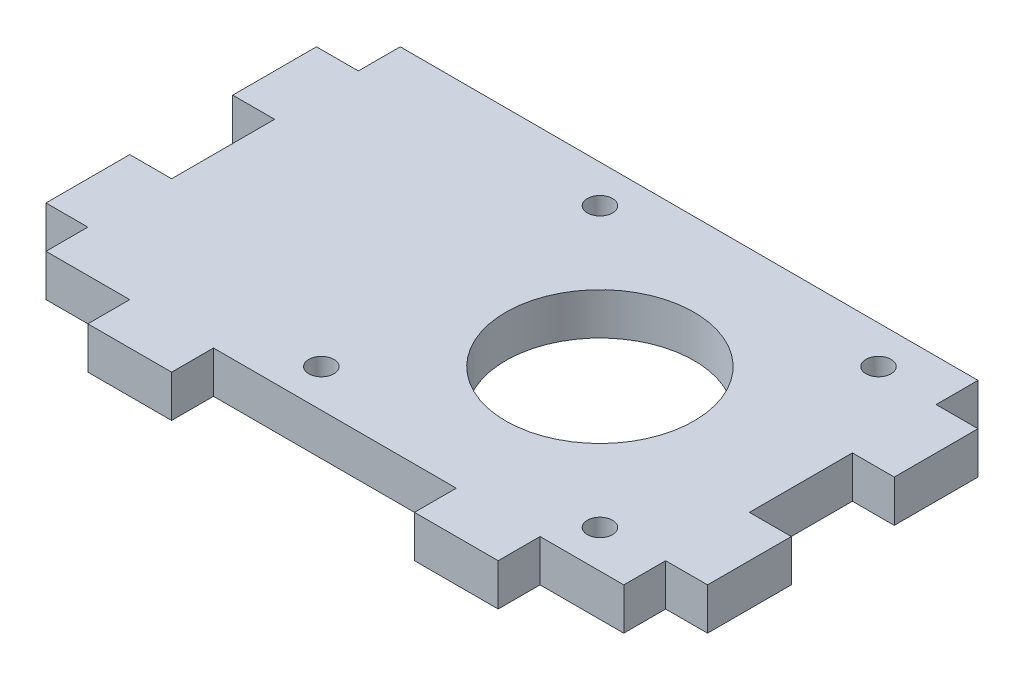
ISO-10303-21;
HEADER;
FILE_DESCRIPTION(('STEP AP214'),'2;1');
FILE_NAME('part.step','',(''),(''),'','','');
FILE_SCHEMA(('AUTOMOTIVE_DESIGN { 1 0 10303 214 1 1 1 1 }'));
ENDSEC;
DATA;
#1=APPLICATION_CONTEXT('core data for automotive mechanical design processes');
#2=APPLICATION_PROTOCOL_DEFINITION('international standard','automotive_design',2000,#1);
#3=PRODUCT_CONTEXT('',#1,'mechanical');
#4=PRODUCT('Part','Part','',(#3));
#5=PRODUCT_RELATED_PRODUCT_CATEGORY('part','',(#4));
#6=PRODUCT_DEFINITION_FORMATION('','',#4);
#7=PRODUCT_DEFINITION_CONTEXT('part definition',#1,'design');
#8=PRODUCT_DEFINITION('design','',#6,#7);
#9=PRODUCT_DEFINITION_SHAPE('','',#8);
#10=(LENGTH_UNIT() NAMED_UNIT(*) SI_UNIT(.MILLI.,.METRE.));
#11=(NAMED_UNIT(*) PLANE_ANGLE_UNIT() SI_UNIT($,.RADIAN.));
#12=(NAMED_UNIT(*) SI_UNIT($,.STERADIAN.) SOLID_ANGLE_UNIT());
#13=UNCERTAINTY_MEASURE_WITH_UNIT(LENGTH_MEASURE(1.E-05),#10,'distance_accuracy_value','');
#14=(GEOMETRIC_REPRESENTATION_CONTEXT(3) GLOBAL_UNCERTAINTY_ASSIGNED_CONTEXT((#13)) GLOBAL_UNIT_ASSIGNED_CONTEXT((#10,
#11,#12)) REPRESENTATION_CONTEXT('',''));
#15=CARTESIAN_POINT('',(0.,0.,0.));
#16=DIRECTION('',(0.,0.,1.));
#17=DIRECTION('',(1.,0.,0.));
#18=AXIS2_PLACEMENT_3D('',#15,#16,#17);
#19=CARTESIAN_POINT('',(0.,5.,0.));
#20=DIRECTION('',(0.,1.,0.));
#21=DIRECTION('',(0.,0.,1.));
#22=AXIS2_PLACEMENT_3D('',#19,#20,#21);
#23=PLANE('',#22);
#24=CARTESIAN_POINT('',(-6.13483146067414,5.,16.6348314606741));
#25=DIRECTION('',(0.,1.,0.));
#26=DIRECTION('',(0.,0.,1.));
#27=AXIS2_PLACEMENT_3D('',#24,#25,#26);
#28=CIRCLE('',#27,1.5);
#29=CARTESIAN_POINT('',(-6.13483146067414,5.,18.1348314606741));
#30=VERTEX_POINT('',#29);
#31=EDGE_CURVE('E504',#30,#30,#28,.T.);
#32=ORIENTED_EDGE('',*,*,#31,.F.);
#33=EDGE_LOOP('',(#32));
#34=FACE_BOUND('',#33,.T.);
#35=CARTESIAN_POINT('',(-6.13483146067414,5.,-16.6348314606741));
#36=DIRECTION('',(0.,1.,0.));
#37=DIRECTION('',(0.,0.,1.));
#38=AXIS2_PLACEMENT_3D('',#35,#36,#37);
#39=CIRCLE('',#38,1.5);
#40=CARTESIAN_POINT('',(-6.13483146067414,5.,-15.1348314606741));
#41=VERTEX_POINT('',#40);
#42=EDGE_CURVE('E516',#41,#41,#39,.T.);
#43=ORIENTED_EDGE('',*,*,#42,.F.);
#44=EDGE_LOOP('',(#43));
#45=FACE_BOUND('',#44,.T.);
#46=DIRECTION('',(0.,0.,-1.));
#47=VECTOR('',#46,1.);
#48=CARTESIAN_POINT('',(34.5,5.,16.15));
#49=LINE('',#48,#47);
#50=CARTESIAN_POINT('',(34.5,5.,21.15));
#51=VERTEX_POINT('',#50);
#52=CARTESIAN_POINT('',(34.5,5.,16.15));
#53=VERTEX_POINT('',#52);
#54=EDGE_CURVE('E306',#51,#53,#49,.T.);
#55=ORIENTED_EDGE('',*,*,#54,.T.);
#56=DIRECTION('',(1.,0.,0.));
#57=VECTOR('',#56,1.);
#58=CARTESIAN_POINT('',(34.5,5.,16.15));
#59=LINE('',#58,#57);
#60=CARTESIAN_POINT('',(39.5,5.,16.15));
#61=VERTEX_POINT('',#60);
#62=EDGE_CURVE('E154',#53,#61,#59,.T.);
#63=ORIENTED_EDGE('',*,*,#62,.T.);
#64=DIRECTION('',(0.,0.,-1.));
#65=VECTOR('',#64,1.);
#66=CARTESIAN_POINT('',(39.5,5.,16.15));
#67=LINE('',#66,#65);
#68=CARTESIAN_POINT('',(39.5,5.,6.15));
#69=VERTEX_POINT('',#68);
#70=EDGE_CURVE('E381',#61,#69,#67,.T.);
#71=ORIENTED_EDGE('',*,*,#70,.T.);
#72=DIRECTION('',(-1.,0.,0.));
#73=VECTOR('',#72,1.);
#74=CARTESIAN_POINT('',(34.5,5.,6.15));
#75=LINE('',#74,#73);
#76=CARTESIAN_POINT('',(34.5,5.,6.15));
#77=VERTEX_POINT('',#76);
#78=EDGE_CURVE('E400',#69,#77,#75,.T.);
#79=ORIENTED_EDGE('',*,*,#78,.T.);
#80=DIRECTION('',(0.,0.,-1.));
#81=VECTOR('',#80,1.);
#82=CARTESIAN_POINT('',(34.5,5.,-6.14999999999999));
#83=LINE('',#82,#81);
#84=CARTESIAN_POINT('',(34.5,5.,-6.14999999999999));
#85=VERTEX_POINT('',#84);
#86=EDGE_CURVE('E397',#77,#85,#83,.T.);
#87=ORIENTED_EDGE('',*,*,#86,.T.);
#88=DIRECTION('',(1.,0.,0.));
#89=VECTOR('',#88,1.);
#90=CARTESIAN_POINT('',(34.5,5.,-6.14999999999999));
#91=LINE('',#90,#89);
#92=CARTESIAN_POINT('',(39.5,5.,-6.14999999999999));
#93=VERTEX_POINT('',#92);
#94=EDGE_CURVE('E399',#85,#93,#91,.T.);
#95=ORIENTED_EDGE('',*,*,#94,.T.);
#96=DIRECTION('',(0.,0.,-1.));
#97=VECTOR('',#96,1.);
#98=CARTESIAN_POINT('',(39.5,5.,-16.15));
#99=LINE('',#98,#97);
#100=CARTESIAN_POINT('',(39.5,5.,-16.15));
#101=VERTEX_POINT('',#100);
#102=EDGE_CURVE('E402',#93,#101,#99,.T.);
#103=ORIENTED_EDGE('',*,*,#102,.T.);
#104=DIRECTION('',(-1.,0.,0.));
#105=VECTOR('',#104,1.);
#106=CARTESIAN_POINT('',(34.5,5.,-16.15));
#107=LINE('',#106,#105);
#108=CARTESIAN_POINT('',(34.5,5.,-16.15));
#109=VERTEX_POINT('',#108);
#110=EDGE_CURVE('E408',#101,#109,#107,.T.);
#111=ORIENTED_EDGE('',*,*,#110,.T.);
#112=DIRECTION('',(0.,0.,-1.));
#113=VECTOR('',#112,1.);
#114=CARTESIAN_POINT('',(34.5,5.,-21.15));
#115=LINE('',#114,#113);
#116=CARTESIAN_POINT('',(34.5,5.,-21.15));
#117=VERTEX_POINT('',#116);
#118=EDGE_CURVE('E410',#109,#117,#115,.T.);
#119=ORIENTED_EDGE('',*,*,#118,.T.);
#120=DIRECTION('',(-1.,0.,0.));
#121=VECTOR('',#120,1.);
#122=CARTESIAN_POINT('',(-34.5,5.,-21.15));
#123=LINE('',#122,#121);
#124=CARTESIAN_POINT('',(-34.5,5.,-21.15));
#125=VERTEX_POINT('',#124);
#126=EDGE_CURVE('E412',#117,#125,#123,.T.);
#127=ORIENTED_EDGE('',*,*,#126,.T.);
#128=DIRECTION('',(0.,0.,1.));
#129=VECTOR('',#128,1.);
#130=CARTESIAN_POINT('',(-34.5,5.,-21.15));
#131=LINE('',#130,#129);
#132=CARTESIAN_POINT('',(-34.5,5.,-16.15));
#133=VERTEX_POINT('',#132);
#134=EDGE_CURVE('E414',#125,#133,#131,.T.);
#135=ORIENTED_EDGE('',*,*,#134,.T.);
#136=DIRECTION('',(-1.,0.,0.));
#137=VECTOR('',#136,1.);
#138=CARTESIAN_POINT('',(-34.5,5.,-16.15));
#139=LINE('',#138,#137);
#140=CARTESIAN_POINT('',(-39.5,5.,-16.15));
#141=VERTEX_POINT('',#140);
#142=EDGE_CURVE('E416',#133,#141,#139,.T.);
#143=ORIENTED_EDGE('',*,*,#142,.T.);
#144=DIRECTION('',(0.,0.,1.));
#145=VECTOR('',#144,1.);
#146=CARTESIAN_POINT('',(-39.5,5.,-16.15));
#147=LINE('',#146,#145);
#148=CARTESIAN_POINT('',(-39.5,5.,-6.14999999999999));
#149=VERTEX_POINT('',#148);
#150=EDGE_CURVE('E418',#141,#149,#147,.T.);
#151=ORIENTED_EDGE('',*,*,#150,.T.);
#152=DIRECTION('',(1.,0.,0.));
#153=VECTOR('',#152,1.);
#154=CARTESIAN_POINT('',(-34.5,5.,-6.14999999999999));
#155=LINE('',#154,#153);
#156=CARTESIAN_POINT('',(-34.5,5.,-6.14999999999999));
#157=VERTEX_POINT('',#156);
#158=EDGE_CURVE('E420',#149,#157,#155,.T.);
#159=ORIENTED_EDGE('',*,*,#158,.T.);
#160=DIRECTION('',(0.,0.,1.));
#161=VECTOR('',#160,1.);
#162=CARTESIAN_POINT('',(-34.5,5.,-6.14999999999999));
#163=LINE('',#162,#161);
#164=CARTESIAN_POINT('',(-34.5,5.,6.15));
#165=VERTEX_POINT('',#164);
#166=EDGE_CURVE('E422',#157,#165,#163,.T.);
#167=ORIENTED_EDGE('',*,*,#166,.T.);
#168=DIRECTION('',(-1.,0.,0.));
#169=VECTOR('',#168,1.);
#170=CARTESIAN_POINT('',(-34.5,5.,6.15));
#171=LINE('',#170,#169);
#172=CARTESIAN_POINT('',(-39.5,5.,6.15));
#173=VERTEX_POINT('',#172);
#174=EDGE_CURVE('E424',#165,#173,#171,.T.);
#175=ORIENTED_EDGE('',*,*,#174,.T.);
#176=DIRECTION('',(0.,0.,1.));
#177=VECTOR('',#176,1.);
#178=CARTESIAN_POINT('',(-39.5,5.,16.15));
#179=LINE('',#178,#177);
#180=CARTESIAN_POINT('',(-39.5,5.,16.15));
#181=VERTEX_POINT('',#180);
#182=EDGE_CURVE('E426',#173,#181,#179,.T.);
#183=ORIENTED_EDGE('',*,*,#182,.T.);
#184=DIRECTION('',(1.,0.,0.));
#185=VECTOR('',#184,1.);
#186=CARTESIAN_POINT('',(-34.5,5.,16.15));
#187=LINE('',#186,#185);
#188=CARTESIAN_POINT('',(-34.5,5.,16.15));
#189=VERTEX_POINT('',#188);
#190=EDGE_CURVE('E428',#181,#189,#187,.T.);
#191=ORIENTED_EDGE('',*,*,#190,.T.);
#192=DIRECTION('',(0.,0.,1.));
#193=VECTOR('',#192,1.);
#194=CARTESIAN_POINT('',(-34.5,5.,16.15));
#195=LINE('',#194,#193);
#196=CARTESIAN_POINT('',(-34.5,5.,21.15));
#197=VERTEX_POINT('',#196);
#198=EDGE_CURVE('E430',#189,#197,#195,.T.);
#199=ORIENTED_EDGE('',*,*,#198,.T.);
#200=DIRECTION('',(1.,0.,0.));
#201=VECTOR('',#200,1.);
#202=CARTESIAN_POINT('',(-34.5,5.,21.15));
#203=LINE('',#202,#201);
#204=CARTESIAN_POINT('',(-24.5,5.,21.15));
#205=VERTEX_POINT('',#204);
#206=EDGE_CURVE('E432',#197,#205,#203,.T.);
#207=ORIENTED_EDGE('',*,*,#206,.T.);
#208=DIRECTION('',(0.,0.,1.));
#209=VECTOR('',#208,1.);
#210=CARTESIAN_POINT('',(-24.5,5.,21.15));
#211=LINE('',#210,#209);
#212=CARTESIAN_POINT('',(-24.5,5.,26.15));
#213=VERTEX_POINT('',#212);
#214=EDGE_CURVE('E434',#205,#213,#211,.T.);
#215=ORIENTED_EDGE('',*,*,#214,.T.);
#216=DIRECTION('',(1.,0.,0.));
#217=VECTOR('',#216,1.);
#218=CARTESIAN_POINT('',(-24.5,5.,26.15));
#219=LINE('',#218,#217);
#220=CARTESIAN_POINT('',(-14.5,5.,26.15));
#221=VERTEX_POINT('',#220);
#222=EDGE_CURVE('E436',#213,#221,#219,.T.);
#223=ORIENTED_EDGE('',*,*,#222,.T.);
#224=DIRECTION('',(0.,0.,-1.));
#225=VECTOR('',#224,1.);
#226=CARTESIAN_POINT('',(-14.5,5.,21.15));
#227=LINE('',#226,#225);
#228=CARTESIAN_POINT('',(-14.5,5.,21.15));
#229=VERTEX_POINT('',#228);
#230=EDGE_CURVE('E438',#221,#229,#227,.T.);
#231=ORIENTED_EDGE('',*,*,#230,.T.);
#232=DIRECTION('',(1.,0.,0.));
#233=VECTOR('',#232,1.);
#234=CARTESIAN_POINT('',(-14.5,5.,21.15));
#235=LINE('',#234,#233);
#236=CARTESIAN_POINT('',(14.5,5.,21.15));
#237=VERTEX_POINT('',#236);
#238=EDGE_CURVE('E440',#229,#237,#235,.T.);
#239=ORIENTED_EDGE('',*,*,#238,.T.);
#240=DIRECTION('',(0.,0.,1.));
#241=VECTOR('',#240,1.);
#242=CARTESIAN_POINT('',(14.5,5.,21.15));
#243=LINE('',#242,#241);
#244=CARTESIAN_POINT('',(14.5,5.,26.15));
#245=VERTEX_POINT('',#244);
#246=EDGE_CURVE('E233',#237,#245,#243,.T.);
#247=ORIENTED_EDGE('',*,*,#246,.T.);
#248=DIRECTION('',(1.,0.,0.));
#249=VECTOR('',#248,1.);
#250=CARTESIAN_POINT('',(24.5,5.,26.15));
#251=LINE('',#250,#249);
#252=CARTESIAN_POINT('',(24.5,5.,26.15));
#253=VERTEX_POINT('',#252);
#254=EDGE_CURVE('E227',#245,#253,#251,.T.);
#255=ORIENTED_EDGE('',*,*,#254,.T.);
#256=DIRECTION('',(0.,0.,-1.));
#257=VECTOR('',#256,1.);
#258=CARTESIAN_POINT('',(24.5,5.,21.15));
#259=LINE('',#258,#257);
#260=CARTESIAN_POINT('',(24.5,5.,21.15));
#261=VERTEX_POINT('',#260);
#262=EDGE_CURVE('E231',#253,#261,#259,.T.);
#263=ORIENTED_EDGE('',*,*,#262,.T.);
#264=DIRECTION('',(1.,0.,0.));
#265=VECTOR('',#264,1.);
#266=CARTESIAN_POINT('',(24.5,5.,21.15));
#267=LINE('',#266,#265);
#268=EDGE_CURVE('E51',#261,#51,#267,.T.);
#269=ORIENTED_EDGE('',*,*,#268,.T.);
#270=EDGE_LOOP('',(#55,#63,#71,#79,#87,#95,#103,#111,#119,#127,#135,#143,#151,#159,#167,#175,
#183,#191,#199,#207,#215,#223,#231,#239,#247,#255,#263,#269));
#271=FACE_BOUND('',#270,.T.);
#272=CARTESIAN_POINT('',(10.5,5.,0.));
#273=DIRECTION('',(0.,1.,0.));
#274=DIRECTION('',(0.,0.,1.));
#275=AXIS2_PLACEMENT_3D('',#272,#273,#274);
#276=CIRCLE('',#275,11.25);
#277=CARTESIAN_POINT('',(10.5,5.,11.25));
#278=VERTEX_POINT('',#277);
#279=EDGE_CURVE('E255',#278,#278,#276,.T.);
#280=ORIENTED_EDGE('',*,*,#279,.F.);
#281=EDGE_LOOP('',(#280));
#282=FACE_BOUND('',#281,.T.);
#283=CARTESIAN_POINT('',(27.1348314606741,5.,-16.6348314606741));
#284=DIRECTION('',(0.,1.,0.));
#285=DIRECTION('',(0.,0.,1.));
#286=AXIS2_PLACEMENT_3D('',#283,#284,#285);
#287=CIRCLE('',#286,1.5);
#288=CARTESIAN_POINT('',(27.1348314606741,5.,-15.1348314606741));
#289=VERTEX_POINT('',#288);
#290=EDGE_CURVE('E510',#289,#289,#287,.T.);
#291=ORIENTED_EDGE('',*,*,#290,.F.);
#292=EDGE_LOOP('',(#291));
#293=FACE_BOUND('',#292,.T.);
#294=CARTESIAN_POINT('',(27.1348314606741,5.,16.6348314606741));
#295=DIRECTION('',(0.,1.,0.));
#296=DIRECTION('',(0.,0.,1.));
#297=AXIS2_PLACEMENT_3D('',#294,#295,#296);
#298=CIRCLE('',#297,1.5);
#299=CARTESIAN_POINT('',(27.1348314606741,5.,18.1348314606741));
#300=VERTEX_POINT('',#299);
#301=EDGE_CURVE('E495',#300,#300,#298,.T.);
#302=ORIENTED_EDGE('',*,*,#301,.F.);
#303=EDGE_LOOP('',(#302));
#304=FACE_BOUND('',#303,.T.);
#305=ADVANCED_FACE('F34',(#34,#45,#271,#282,#293,#304),#23,.T.);
#306=CARTESIAN_POINT('',(0.,0.,0.));
#307=DIRECTION('',(0.,1.,0.));
#308=DIRECTION('',(0.,0.,1.));
#309=AXIS2_PLACEMENT_3D('',#306,#307,#308);
#310=PLANE('',#309);
#311=DIRECTION('',(0.,0.,-1.));
#312=VECTOR('',#311,1.);
#313=CARTESIAN_POINT('',(34.5,0.,16.15));
#314=LINE('',#313,#312);
#315=CARTESIAN_POINT('',(34.5,0.,21.15));
#316=VERTEX_POINT('',#315);
#317=CARTESIAN_POINT('',(34.5,0.,16.15));
#318=VERTEX_POINT('',#317);
#319=EDGE_CURVE('E251',#316,#318,#314,.T.);
#320=ORIENTED_EDGE('',*,*,#319,.F.);
#321=DIRECTION('',(1.,0.,0.));
#322=VECTOR('',#321,1.);
#323=CARTESIAN_POINT('',(24.5,0.,21.15));
#324=LINE('',#323,#322);
#325=CARTESIAN_POINT('',(24.5,0.,21.15));
#326=VERTEX_POINT('',#325);
#327=EDGE_CURVE('E146',#326,#316,#324,.T.);
#328=ORIENTED_EDGE('',*,*,#327,.F.);
#329=DIRECTION('',(0.,0.,-1.));
#330=VECTOR('',#329,1.);
#331=CARTESIAN_POINT('',(24.5,0.,21.15));
#332=LINE('',#331,#330);
#333=CARTESIAN_POINT('',(24.5,0.,26.15));
#334=VERTEX_POINT('',#333);
#335=EDGE_CURVE('E140',#334,#326,#332,.T.);
#336=ORIENTED_EDGE('',*,*,#335,.F.);
#337=DIRECTION('',(1.,0.,0.));
#338=VECTOR('',#337,1.);
#339=CARTESIAN_POINT('',(24.5,0.,26.15));
#340=LINE('',#339,#338);
#341=CARTESIAN_POINT('',(14.5,0.,26.15));
#342=VERTEX_POINT('',#341);
#343=EDGE_CURVE('E241',#342,#334,#340,.T.);
#344=ORIENTED_EDGE('',*,*,#343,.F.);
#345=DIRECTION('',(0.,0.,1.));
#346=VECTOR('',#345,1.);
#347=CARTESIAN_POINT('',(14.5,0.,21.15));
#348=LINE('',#347,#346);
#349=CARTESIAN_POINT('',(14.5,0.,21.15));
#350=VERTEX_POINT('',#349);
#351=EDGE_CURVE('E301',#350,#342,#348,.T.);
#352=ORIENTED_EDGE('',*,*,#351,.F.);
#353=DIRECTION('',(1.,0.,0.));
#354=VECTOR('',#353,1.);
#355=CARTESIAN_POINT('',(-14.5,0.,21.15));
#356=LINE('',#355,#354);
#357=CARTESIAN_POINT('',(-14.5,0.,21.15));
#358=VERTEX_POINT('',#357);
#359=EDGE_CURVE('E299',#358,#350,#356,.T.);
#360=ORIENTED_EDGE('',*,*,#359,.F.);
#361=DIRECTION('',(0.,0.,-1.));
#362=VECTOR('',#361,1.);
#363=CARTESIAN_POINT('',(-14.5,0.,21.15));
#364=LINE('',#363,#362);
#365=CARTESIAN_POINT('',(-14.5,0.,26.15));
#366=VERTEX_POINT('',#365);
#367=EDGE_CURVE('E297',#366,#358,#364,.T.);
#368=ORIENTED_EDGE('',*,*,#367,.F.);
#369=DIRECTION('',(1.,0.,0.));
#370=VECTOR('',#369,1.);
#371=CARTESIAN_POINT('',(-24.5,0.,26.15));
#372=LINE('',#371,#370);
#373=CARTESIAN_POINT('',(-24.5,0.,26.15));
#374=VERTEX_POINT('',#373);
#375=EDGE_CURVE('E295',#374,#366,#372,.T.);
#376=ORIENTED_EDGE('',*,*,#375,.F.);
#377=DIRECTION('',(0.,0.,1.));
#378=VECTOR('',#377,1.);
#379=CARTESIAN_POINT('',(-24.5,0.,21.15));
#380=LINE('',#379,#378);
#381=CARTESIAN_POINT('',(-24.5,0.,21.15));
#382=VERTEX_POINT('',#381);
#383=EDGE_CURVE('E293',#382,#374,#380,.T.);
#384=ORIENTED_EDGE('',*,*,#383,.F.);
#385=DIRECTION('',(1.,0.,0.));
#386=VECTOR('',#385,1.);
#387=CARTESIAN_POINT('',(-34.5,0.,21.15));
#388=LINE('',#387,#386);
#389=CARTESIAN_POINT('',(-34.5,0.,21.15));
#390=VERTEX_POINT('',#389);
#391=EDGE_CURVE('E291',#390,#382,#388,.T.);
#392=ORIENTED_EDGE('',*,*,#391,.F.);
#393=DIRECTION('',(0.,0.,1.));
#394=VECTOR('',#393,1.);
#395=CARTESIAN_POINT('',(-34.5,0.,16.15));
#396=LINE('',#395,#394);
#397=CARTESIAN_POINT('',(-34.5,0.,16.15));
#398=VERTEX_POINT('',#397);
#399=EDGE_CURVE('E289',#398,#390,#396,.T.);
#400=ORIENTED_EDGE('',*,*,#399,.F.);
#401=DIRECTION('',(1.,0.,0.));
#402=VECTOR('',#401,1.);
#403=CARTESIAN_POINT('',(-34.5,0.,16.15));
#404=LINE('',#403,#402);
#405=CARTESIAN_POINT('',(-39.5,0.,16.15));
#406=VERTEX_POINT('',#405);
#407=EDGE_CURVE('E287',#406,#398,#404,.T.);
#408=ORIENTED_EDGE('',*,*,#407,.F.);
#409=DIRECTION('',(0.,0.,1.));
#410=VECTOR('',#409,1.);
#411=CARTESIAN_POINT('',(-39.5,0.,16.15));
#412=LINE('',#411,#410);
#413=CARTESIAN_POINT('',(-39.5,0.,6.15));
#414=VERTEX_POINT('',#413);
#415=EDGE_CURVE('E285',#414,#406,#412,.T.);
#416=ORIENTED_EDGE('',*,*,#415,.F.);
#417=DIRECTION('',(-1.,0.,0.));
#418=VECTOR('',#417,1.);
#419=CARTESIAN_POINT('',(-34.5,0.,6.15));
#420=LINE('',#419,#418);
#421=CARTESIAN_POINT('',(-34.5,0.,6.15));
#422=VERTEX_POINT('',#421);
#423=EDGE_CURVE('E283',#422,#414,#420,.T.);
#424=ORIENTED_EDGE('',*,*,#423,.F.);
#425=DIRECTION('',(0.,0.,1.));
#426=VECTOR('',#425,1.);
#427=CARTESIAN_POINT('',(-34.5,0.,-6.14999999999999));
#428=LINE('',#427,#426);
#429=CARTESIAN_POINT('',(-34.5,0.,-6.14999999999999));
#430=VERTEX_POINT('',#429);
#431=EDGE_CURVE('E281',#430,#422,#428,.T.);
#432=ORIENTED_EDGE('',*,*,#431,.F.);
#433=DIRECTION('',(1.,0.,0.));
#434=VECTOR('',#433,1.);
#435=CARTESIAN_POINT('',(-34.5,0.,-6.14999999999999));
#436=LINE('',#435,#434);
#437=CARTESIAN_POINT('',(-39.5,0.,-6.14999999999999));
#438=VERTEX_POINT('',#437);
#439=EDGE_CURVE('E279',#438,#430,#436,.T.);
#440=ORIENTED_EDGE('',*,*,#439,.F.);
#441=DIRECTION('',(0.,0.,1.));
#442=VECTOR('',#441,1.);
#443=CARTESIAN_POINT('',(-39.5,0.,-16.15));
#444=LINE('',#443,#442);
#445=CARTESIAN_POINT('',(-39.5,0.,-16.15));
#446=VERTEX_POINT('',#445);
#447=EDGE_CURVE('E277',#446,#438,#444,.T.);
#448=ORIENTED_EDGE('',*,*,#447,.F.);
#449=DIRECTION('',(-1.,0.,0.));
#450=VECTOR('',#449,1.);
#451=CARTESIAN_POINT('',(-34.5,0.,-16.15));
#452=LINE('',#451,#450);
#453=CARTESIAN_POINT('',(-34.5,0.,-16.15));
#454=VERTEX_POINT('',#453);
#455=EDGE_CURVE('E275',#454,#446,#452,.T.);
#456=ORIENTED_EDGE('',*,*,#455,.F.);
#457=DIRECTION('',(0.,0.,1.));
#458=VECTOR('',#457,1.);
#459=CARTESIAN_POINT('',(-34.5,0.,-21.15));
#460=LINE('',#459,#458);
#461=CARTESIAN_POINT('',(-34.5,0.,-21.15));
#462=VERTEX_POINT('',#461);
#463=EDGE_CURVE('E273',#462,#454,#460,.T.);
#464=ORIENTED_EDGE('',*,*,#463,.F.);
#465=DIRECTION('',(-1.,0.,0.));
#466=VECTOR('',#465,1.);
#467=CARTESIAN_POINT('',(-34.5,0.,-21.15));
#468=LINE('',#467,#466);
#469=CARTESIAN_POINT('',(34.5,0.,-21.15));
#470=VERTEX_POINT('',#469);
#471=EDGE_CURVE('E271',#470,#462,#468,.T.);
#472=ORIENTED_EDGE('',*,*,#471,.F.);
#473=DIRECTION('',(0.,0.,-1.));
#474=VECTOR('',#473,1.);
#475=CARTESIAN_POINT('',(34.5,0.,-21.15));
#476=LINE('',#475,#474);
#477=CARTESIAN_POINT('',(34.5,0.,-16.15));
#478=VERTEX_POINT('',#477);
#479=EDGE_CURVE('E269',#478,#470,#476,.T.);
#480=ORIENTED_EDGE('',*,*,#479,.F.);
#481=DIRECTION('',(-1.,0.,0.));
#482=VECTOR('',#481,1.);
#483=CARTESIAN_POINT('',(34.5,0.,-16.15));
#484=LINE('',#483,#482);
#485=CARTESIAN_POINT('',(39.5,0.,-16.15));
#486=VERTEX_POINT('',#485);
#487=EDGE_CURVE('E267',#486,#478,#484,.T.);
#488=ORIENTED_EDGE('',*,*,#487,.F.);
#489=DIRECTION('',(0.,0.,-1.));
#490=VECTOR('',#489,1.);
#491=CARTESIAN_POINT('',(39.5,0.,-16.15));
#492=LINE('',#491,#490);
#493=CARTESIAN_POINT('',(39.5,0.,-6.14999999999999));
#494=VERTEX_POINT('',#493);
#495=EDGE_CURVE('E265',#494,#486,#492,.T.);
#496=ORIENTED_EDGE('',*,*,#495,.F.);
#497=DIRECTION('',(1.,0.,0.));
#498=VECTOR('',#497,1.);
#499=CARTESIAN_POINT('',(34.5,0.,-6.14999999999999));
#500=LINE('',#499,#498);
#501=CARTESIAN_POINT('',(34.5,0.,-6.14999999999999));
#502=VERTEX_POINT('',#501);
#503=EDGE_CURVE('E263',#502,#494,#500,.T.);
#504=ORIENTED_EDGE('',*,*,#503,.F.);
#505=DIRECTION('',(0.,0.,-1.));
#506=VECTOR('',#505,1.);
#507=CARTESIAN_POINT('',(34.5,0.,-6.14999999999999));
#508=LINE('',#507,#506);
#509=CARTESIAN_POINT('',(34.5,0.,6.15));
#510=VERTEX_POINT('',#509);
#511=EDGE_CURVE('E261',#510,#502,#508,.T.);
#512=ORIENTED_EDGE('',*,*,#511,.F.);
#513=DIRECTION('',(-1.,0.,0.));
#514=VECTOR('',#513,1.);
#515=CARTESIAN_POINT('',(34.5,0.,6.15));
#516=LINE('',#515,#514);
#517=CARTESIAN_POINT('',(39.5,0.,6.15));
#518=VERTEX_POINT('',#517);
#519=EDGE_CURVE('E259',#518,#510,#516,.T.);
#520=ORIENTED_EDGE('',*,*,#519,.F.);
#521=DIRECTION('',(0.,0.,-1.));
#522=VECTOR('',#521,1.);
#523=CARTESIAN_POINT('',(39.5,0.,16.15));
#524=LINE('',#523,#522);
#525=CARTESIAN_POINT('',(39.5,0.,16.15));
#526=VERTEX_POINT('',#525);
#527=EDGE_CURVE('E257',#526,#518,#524,.T.);
#528=ORIENTED_EDGE('',*,*,#527,.F.);
#529=DIRECTION('',(1.,0.,0.));
#530=VECTOR('',#529,1.);
#531=CARTESIAN_POINT('',(34.5,0.,16.15));
#532=LINE('',#531,#530);
#533=EDGE_CURVE('E254',#318,#526,#532,.T.);
#534=ORIENTED_EDGE('',*,*,#533,.F.);
#535=EDGE_LOOP('',(#320,#328,#336,#344,#352,#360,#368,#376,#384,#392,#400,#408,#416,#424,#432,
#440,#448,#456,#464,#472,#480,#488,#496,#504,#512,#520,#528,#534));
#536=FACE_BOUND('',#535,.T.);
#537=CARTESIAN_POINT('',(10.5,0.,0.));
#538=DIRECTION('',(0.,1.,0.));
#539=DIRECTION('',(0.,0.,1.));
#540=AXIS2_PLACEMENT_3D('',#537,#538,#539);
#541=CIRCLE('',#540,11.25);
#542=CARTESIAN_POINT('',(10.5,0.,11.25));
#543=VERTEX_POINT('',#542);
#544=EDGE_CURVE('E519',#543,#543,#541,.T.);
#545=ORIENTED_EDGE('',*,*,#544,.T.);
#546=EDGE_LOOP('',(#545));
#547=FACE_BOUND('',#546,.T.);
#548=CARTESIAN_POINT('',(-6.13483146067414,0.,-16.6348314606741));
#549=DIRECTION('',(0.,1.,0.));
#550=DIRECTION('',(0.,0.,1.));
#551=AXIS2_PLACEMENT_3D('',#548,#549,#550);
#552=CIRCLE('',#551,1.5);
#553=CARTESIAN_POINT('',(-6.13483146067414,0.,-15.1348314606741));
#554=VERTEX_POINT('',#553);
#555=EDGE_CURVE('E513',#554,#554,#552,.T.);
#556=ORIENTED_EDGE('',*,*,#555,.T.);
#557=EDGE_LOOP('',(#556));
#558=FACE_BOUND('',#557,.T.);
#559=CARTESIAN_POINT('',(27.1348314606741,0.,-16.6348314606741));
#560=DIRECTION('',(0.,1.,0.));
#561=DIRECTION('',(0.,0.,1.));
#562=AXIS2_PLACEMENT_3D('',#559,#560,#561);
#563=CIRCLE('',#562,1.5);
#564=CARTESIAN_POINT('',(27.1348314606741,0.,-15.1348314606741));
#565=VERTEX_POINT('',#564);
#566=EDGE_CURVE('E507',#565,#565,#563,.T.);
#567=ORIENTED_EDGE('',*,*,#566,.T.);
#568=EDGE_LOOP('',(#567));
#569=FACE_BOUND('',#568,.T.);
#570=CARTESIAN_POINT('',(-6.13483146067414,0.,16.6348314606741));
#571=DIRECTION('',(0.,1.,0.));
#572=DIRECTION('',(0.,0.,1.));
#573=AXIS2_PLACEMENT_3D('',#570,#571,#572);
#574=CIRCLE('',#573,1.5);
#575=CARTESIAN_POINT('',(-6.13483146067414,0.,18.1348314606741));
#576=VERTEX_POINT('',#575);
#577=EDGE_CURVE('E501',#576,#576,#574,.T.);
#578=ORIENTED_EDGE('',*,*,#577,.T.);
#579=EDGE_LOOP('',(#578));
#580=FACE_BOUND('',#579,.T.);
#581=CARTESIAN_POINT('',(27.1348314606741,0.,16.6348314606741));
#582=DIRECTION('',(0.,1.,0.));
#583=DIRECTION('',(0.,0.,1.));
#584=AXIS2_PLACEMENT_3D('',#581,#582,#583);
#585=CIRCLE('',#584,1.5);
#586=CARTESIAN_POINT('',(27.1348314606741,0.,18.1348314606741));
#587=VERTEX_POINT('',#586);
#588=EDGE_CURVE('E498',#587,#587,#585,.T.);
#589=ORIENTED_EDGE('',*,*,#588,.T.);
#590=EDGE_LOOP('',(#589));
#591=FACE_BOUND('',#590,.T.);
#592=ADVANCED_FACE('F385',(#536,#547,#558,#569,#580,#591),#310,.F.);
#593=CARTESIAN_POINT('',(34.5,5.,16.15));
#594=DIRECTION('',(-1.,0.,0.));
#595=DIRECTION('',(0.,0.,1.));
#596=AXIS2_PLACEMENT_3D('',#593,#594,#595);
#597=PLANE('',#596);
#598=ORIENTED_EDGE('',*,*,#319,.T.);
#599=DIRECTION('',(0.,-1.,0.));
#600=VECTOR('',#599,1.);
#601=CARTESIAN_POINT('',(34.5,5.,16.15));
#602=LINE('',#601,#600);
#603=EDGE_CURVE('E11',#53,#318,#602,.T.);
#604=ORIENTED_EDGE('',*,*,#603,.F.);
#605=ORIENTED_EDGE('',*,*,#54,.F.);
#606=DIRECTION('',(0.,-1.,0.));
#607=VECTOR('',#606,1.);
#608=CARTESIAN_POINT('',(34.5,5.,21.15));
#609=LINE('',#608,#607);
#610=EDGE_CURVE('E247',#51,#316,#609,.T.);
#611=ORIENTED_EDGE('',*,*,#610,.T.);
#612=EDGE_LOOP('',(#598,#604,#605,#611));
#613=FACE_BOUND('',#612,.T.);
#614=ADVANCED_FACE('F36',(#613),#597,.F.);
#615=CARTESIAN_POINT('',(34.5,5.,16.15));
#616=DIRECTION('',(0.,0.,-1.));
#617=DIRECTION('',(-1.,0.,0.));
#618=AXIS2_PLACEMENT_3D('',#615,#616,#617);
#619=PLANE('',#618);
#620=ORIENTED_EDGE('',*,*,#533,.T.);
#621=DIRECTION('',(0.,-1.,0.));
#622=VECTOR('',#621,1.);
#623=CARTESIAN_POINT('',(39.5,5.,16.15));
#624=LINE('',#623,#622);
#625=EDGE_CURVE('E43',#61,#526,#624,.T.);
#626=ORIENTED_EDGE('',*,*,#625,.F.);
#627=ORIENTED_EDGE('',*,*,#62,.F.);
#628=ORIENTED_EDGE('',*,*,#603,.T.);
#629=EDGE_LOOP('',(#620,#626,#627,#628));
#630=FACE_BOUND('',#629,.T.);
#631=ADVANCED_FACE('F798',(#630),#619,.F.);
#632=CARTESIAN_POINT('',(39.5,5.,16.15));
#633=DIRECTION('',(-1.,0.,0.));
#634=DIRECTION('',(0.,0.,1.));
#635=AXIS2_PLACEMENT_3D('',#632,#633,#634);
#636=PLANE('',#635);
#637=ORIENTED_EDGE('',*,*,#527,.T.);
#638=DIRECTION('',(0.,-1.,0.));
#639=VECTOR('',#638,1.);
#640=CARTESIAN_POINT('',(39.5,5.,6.15));
#641=LINE('',#640,#639);
#642=EDGE_CURVE('E373',#69,#518,#641,.T.);
#643=ORIENTED_EDGE('',*,*,#642,.F.);
#644=ORIENTED_EDGE('',*,*,#70,.F.);
#645=ORIENTED_EDGE('',*,*,#625,.T.);
#646=EDGE_LOOP('',(#637,#643,#644,#645));
#647=FACE_BOUND('',#646,.T.);
#648=ADVANCED_FACE('F379',(#647),#636,.F.);
#649=CARTESIAN_POINT('',(34.5,5.,6.15));
#650=DIRECTION('',(0.,0.,1.));
#651=DIRECTION('',(1.,0.,0.));
#652=AXIS2_PLACEMENT_3D('',#649,#650,#651);
#653=PLANE('',#652);
#654=ORIENTED_EDGE('',*,*,#519,.T.);
#655=DIRECTION('',(0.,-1.,0.));
#656=VECTOR('',#655,1.);
#657=CARTESIAN_POINT('',(34.5,5.,6.15));
#658=LINE('',#657,#656);
#659=EDGE_CURVE('E370',#77,#510,#658,.T.);
#660=ORIENTED_EDGE('',*,*,#659,.F.);
#661=ORIENTED_EDGE('',*,*,#78,.F.);
#662=ORIENTED_EDGE('',*,*,#642,.T.);
#663=EDGE_LOOP('',(#654,#660,#661,#662));
#664=FACE_BOUND('',#663,.T.);
#665=ADVANCED_FACE('F391',(#664),#653,.F.);
#666=CARTESIAN_POINT('',(34.5,5.,-6.14999999999999));
#667=DIRECTION('',(-1.,0.,0.));
#668=DIRECTION('',(0.,0.,1.));
#669=AXIS2_PLACEMENT_3D('',#666,#667,#668);
#670=PLANE('',#669);
#671=ORIENTED_EDGE('',*,*,#511,.T.);
#672=DIRECTION('',(0.,-1.,0.));
#673=VECTOR('',#672,1.);
#674=CARTESIAN_POINT('',(34.5,5.,-6.14999999999999));
#675=LINE('',#674,#673);
#676=EDGE_CURVE('E367',#85,#502,#675,.T.);
#677=ORIENTED_EDGE('',*,*,#676,.F.);
#678=ORIENTED_EDGE('',*,*,#86,.F.);
#679=ORIENTED_EDGE('',*,*,#659,.T.);
#680=EDGE_LOOP('',(#671,#677,#678,#679));
#681=FACE_BOUND('',#680,.T.);
#682=ADVANCED_FACE('F395',(#681),#670,.F.);
#683=CARTESIAN_POINT('',(34.5,5.,-6.14999999999999));
#684=DIRECTION('',(0.,0.,-1.));
#685=DIRECTION('',(-1.,0.,0.));
#686=AXIS2_PLACEMENT_3D('',#683,#684,#685);
#687=PLANE('',#686);
#688=ORIENTED_EDGE('',*,*,#503,.T.);
#689=DIRECTION('',(0.,-1.,0.));
#690=VECTOR('',#689,1.);
#691=CARTESIAN_POINT('',(39.5,5.,-6.14999999999999));
#692=LINE('',#691,#690);
#693=EDGE_CURVE('E364',#93,#494,#692,.T.);
#694=ORIENTED_EDGE('',*,*,#693,.F.);
#695=ORIENTED_EDGE('',*,*,#94,.F.);
#696=ORIENTED_EDGE('',*,*,#676,.T.);
#697=EDGE_LOOP('',(#688,#694,#695,#696));
#698=FACE_BOUND('',#697,.T.);
#699=ADVANCED_FACE('F763',(#698),#687,.F.);
#700=CARTESIAN_POINT('',(39.5,5.,-16.15));
#701=DIRECTION('',(-1.,0.,0.));
#702=DIRECTION('',(0.,0.,1.));
#703=AXIS2_PLACEMENT_3D('',#700,#701,#702);
#704=PLANE('',#703);
#705=ORIENTED_EDGE('',*,*,#495,.T.);
#706=DIRECTION('',(0.,-1.,0.));
#707=VECTOR('',#706,1.);
#708=CARTESIAN_POINT('',(39.5,5.,-16.15));
#709=LINE('',#708,#707);
#710=EDGE_CURVE('E361',#101,#486,#709,.T.);
#711=ORIENTED_EDGE('',*,*,#710,.F.);
#712=ORIENTED_EDGE('',*,*,#102,.F.);
#713=ORIENTED_EDGE('',*,*,#693,.T.);
#714=EDGE_LOOP('',(#705,#711,#712,#713));
#715=FACE_BOUND('',#714,.T.);
#716=ADVANCED_FACE('F753',(#715),#704,.F.);
#717=CARTESIAN_POINT('',(34.5,5.,-16.15));
#718=DIRECTION('',(0.,0.,1.));
#719=DIRECTION('',(1.,0.,0.));
#720=AXIS2_PLACEMENT_3D('',#717,#718,#719);
#721=PLANE('',#720);
#722=ORIENTED_EDGE('',*,*,#487,.T.);
#723=DIRECTION('',(0.,-1.,0.));
#724=VECTOR('',#723,1.);
#725=CARTESIAN_POINT('',(34.5,5.,-16.15));
#726=LINE('',#725,#724);
#727=EDGE_CURVE('E358',#109,#478,#726,.T.);
#728=ORIENTED_EDGE('',*,*,#727,.F.);
#729=ORIENTED_EDGE('',*,*,#110,.F.);
#730=ORIENTED_EDGE('',*,*,#710,.T.);
#731=EDGE_LOOP('',(#722,#728,#729,#730));
#732=FACE_BOUND('',#731,.T.);
#733=ADVANCED_FACE('F743',(#732),#721,.F.);
#734=CARTESIAN_POINT('',(34.5,5.,-21.15));
#735=DIRECTION('',(-1.,0.,0.));
#736=DIRECTION('',(0.,0.,1.));
#737=AXIS2_PLACEMENT_3D('',#734,#735,#736);
#738=PLANE('',#737);
#739=ORIENTED_EDGE('',*,*,#479,.T.);
#740=DIRECTION('',(0.,-1.,0.));
#741=VECTOR('',#740,1.);
#742=CARTESIAN_POINT('',(34.5,5.,-21.15));
#743=LINE('',#742,#741);
#744=EDGE_CURVE('E355',#117,#470,#743,.T.);
#745=ORIENTED_EDGE('',*,*,#744,.F.);
#746=ORIENTED_EDGE('',*,*,#118,.F.);
#747=ORIENTED_EDGE('',*,*,#727,.T.);
#748=EDGE_LOOP('',(#739,#745,#746,#747));
#749=FACE_BOUND('',#748,.T.);
#750=ADVANCED_FACE('F733',(#749),#738,.F.);
#751=CARTESIAN_POINT('',(-34.5,5.,-21.15));
#752=DIRECTION('',(0.,0.,1.));
#753=DIRECTION('',(1.,0.,0.));
#754=AXIS2_PLACEMENT_3D('',#751,#752,#753);
#755=PLANE('',#754);
#756=ORIENTED_EDGE('',*,*,#471,.T.);
#757=DIRECTION('',(0.,-1.,0.));
#758=VECTOR('',#757,1.);
#759=CARTESIAN_POINT('',(-34.5,5.,-21.15));
#760=LINE('',#759,#758);
#761=EDGE_CURVE('E352',#125,#462,#760,.T.);
#762=ORIENTED_EDGE('',*,*,#761,.F.);
#763=ORIENTED_EDGE('',*,*,#126,.F.);
#764=ORIENTED_EDGE('',*,*,#744,.T.);
#765=EDGE_LOOP('',(#756,#762,#763,#764));
#766=FACE_BOUND('',#765,.T.);
#767=ADVANCED_FACE('F723',(#766),#755,.F.);
#768=CARTESIAN_POINT('',(-34.5,5.,-21.15));
#769=DIRECTION('',(1.,0.,0.));
#770=DIRECTION('',(0.,0.,-1.));
#771=AXIS2_PLACEMENT_3D('',#768,#769,#770);
#772=PLANE('',#771);
#773=ORIENTED_EDGE('',*,*,#463,.T.);
#774=DIRECTION('',(0.,-1.,0.));
#775=VECTOR('',#774,1.);
#776=CARTESIAN_POINT('',(-34.5,5.,-16.15));
#777=LINE('',#776,#775);
#778=EDGE_CURVE('E349',#133,#454,#777,.T.);
#779=ORIENTED_EDGE('',*,*,#778,.F.);
#780=ORIENTED_EDGE('',*,*,#134,.F.);
#781=ORIENTED_EDGE('',*,*,#761,.T.);
#782=EDGE_LOOP('',(#773,#779,#780,#781));
#783=FACE_BOUND('',#782,.T.);
#784=ADVANCED_FACE('F713',(#783),#772,.F.);
#785=CARTESIAN_POINT('',(-34.5,5.,-16.15));
#786=DIRECTION('',(0.,0.,1.));
#787=DIRECTION('',(1.,0.,0.));
#788=AXIS2_PLACEMENT_3D('',#785,#786,#787);
#789=PLANE('',#788);
#790=ORIENTED_EDGE('',*,*,#455,.T.);
#791=DIRECTION('',(0.,-1.,0.));
#792=VECTOR('',#791,1.);
#793=CARTESIAN_POINT('',(-39.5,5.,-16.15));
#794=LINE('',#793,#792);
#795=EDGE_CURVE('E346',#141,#446,#794,.T.);
#796=ORIENTED_EDGE('',*,*,#795,.F.);
#797=ORIENTED_EDGE('',*,*,#142,.F.);
#798=ORIENTED_EDGE('',*,*,#778,.T.);
#799=EDGE_LOOP('',(#790,#796,#797,#798));
#800=FACE_BOUND('',#799,.T.);
#801=ADVANCED_FACE('F703',(#800),#789,.F.);
#802=CARTESIAN_POINT('',(-39.5,5.,-16.15));
#803=DIRECTION('',(1.,0.,0.));
#804=DIRECTION('',(0.,0.,-1.));
#805=AXIS2_PLACEMENT_3D('',#802,#803,#804);
#806=PLANE('',#805);
#807=ORIENTED_EDGE('',*,*,#447,.T.);
#808=DIRECTION('',(0.,-1.,0.));
#809=VECTOR('',#808,1.);
#810=CARTESIAN_POINT('',(-39.5,5.,-6.14999999999999));
#811=LINE('',#810,#809);
#812=EDGE_CURVE('E343',#149,#438,#811,.T.);
#813=ORIENTED_EDGE('',*,*,#812,.F.);
#814=ORIENTED_EDGE('',*,*,#150,.F.);
#815=ORIENTED_EDGE('',*,*,#795,.T.);
#816=EDGE_LOOP('',(#807,#813,#814,#815));
#817=FACE_BOUND('',#816,.T.);
#818=ADVANCED_FACE('F693',(#817),#806,.F.);
#819=CARTESIAN_POINT('',(-34.5,5.,-6.14999999999999));
#820=DIRECTION('',(0.,0.,-1.));
#821=DIRECTION('',(-1.,0.,0.));
#822=AXIS2_PLACEMENT_3D('',#819,#820,#821);
#823=PLANE('',#822);
#824=ORIENTED_EDGE('',*,*,#439,.T.);
#825=DIRECTION('',(0.,-1.,0.));
#826=VECTOR('',#825,1.);
#827=CARTESIAN_POINT('',(-34.5,5.,-6.14999999999999));
#828=LINE('',#827,#826);
#829=EDGE_CURVE('E340',#157,#430,#828,.T.);
#830=ORIENTED_EDGE('',*,*,#829,.F.);
#831=ORIENTED_EDGE('',*,*,#158,.F.);
#832=ORIENTED_EDGE('',*,*,#812,.T.);
#833=EDGE_LOOP('',(#824,#830,#831,#832));
#834=FACE_BOUND('',#833,.T.);
#835=ADVANCED_FACE('F683',(#834),#823,.F.);
#836=CARTESIAN_POINT('',(-34.5,5.,-6.14999999999999));
#837=DIRECTION('',(1.,0.,0.));
#838=DIRECTION('',(0.,0.,-1.));
#839=AXIS2_PLACEMENT_3D('',#836,#837,#838);
#840=PLANE('',#839);
#841=ORIENTED_EDGE('',*,*,#431,.T.);
#842=DIRECTION('',(0.,-1.,0.));
#843=VECTOR('',#842,1.);
#844=CARTESIAN_POINT('',(-34.5,5.,6.15));
#845=LINE('',#844,#843);
#846=EDGE_CURVE('E337',#165,#422,#845,.T.);
#847=ORIENTED_EDGE('',*,*,#846,.F.);
#848=ORIENTED_EDGE('',*,*,#166,.F.);
#849=ORIENTED_EDGE('',*,*,#829,.T.);
#850=EDGE_LOOP('',(#841,#847,#848,#849));
#851=FACE_BOUND('',#850,.T.);
#852=ADVANCED_FACE('F673',(#851),#840,.F.);
#853=CARTESIAN_POINT('',(-34.5,5.,6.15));
#854=DIRECTION('',(0.,0.,1.));
#855=DIRECTION('',(1.,0.,0.));
#856=AXIS2_PLACEMENT_3D('',#853,#854,#855);
#857=PLANE('',#856);
#858=ORIENTED_EDGE('',*,*,#423,.T.);
#859=DIRECTION('',(0.,-1.,0.));
#860=VECTOR('',#859,1.);
#861=CARTESIAN_POINT('',(-39.5,5.,6.15));
#862=LINE('',#861,#860);
#863=EDGE_CURVE('E334',#173,#414,#862,.T.);
#864=ORIENTED_EDGE('',*,*,#863,.F.);
#865=ORIENTED_EDGE('',*,*,#174,.F.);
#866=ORIENTED_EDGE('',*,*,#846,.T.);
#867=EDGE_LOOP('',(#858,#864,#865,#866));
#868=FACE_BOUND('',#867,.T.);
#869=ADVANCED_FACE('F663',(#868),#857,.F.);
#870=CARTESIAN_POINT('',(-39.5,5.,16.15));
#871=DIRECTION('',(1.,0.,0.));
#872=DIRECTION('',(0.,0.,-1.));
#873=AXIS2_PLACEMENT_3D('',#870,#871,#872);
#874=PLANE('',#873);
#875=ORIENTED_EDGE('',*,*,#415,.T.);
#876=DIRECTION('',(0.,-1.,0.));
#877=VECTOR('',#876,1.);
#878=CARTESIAN_POINT('',(-39.5,5.,16.15));
#879=LINE('',#878,#877);
#880=EDGE_CURVE('E331',#181,#406,#879,.T.);
#881=ORIENTED_EDGE('',*,*,#880,.F.);
#882=ORIENTED_EDGE('',*,*,#182,.F.);
#883=ORIENTED_EDGE('',*,*,#863,.T.);
#884=EDGE_LOOP('',(#875,#881,#882,#883));
#885=FACE_BOUND('',#884,.T.);
#886=ADVANCED_FACE('F653',(#885),#874,.F.);
#887=CARTESIAN_POINT('',(-34.5,5.,16.15));
#888=DIRECTION('',(0.,0.,-1.));
#889=DIRECTION('',(-1.,0.,0.));
#890=AXIS2_PLACEMENT_3D('',#887,#888,#889);
#891=PLANE('',#890);
#892=ORIENTED_EDGE('',*,*,#407,.T.);
#893=DIRECTION('',(0.,-1.,0.));
#894=VECTOR('',#893,1.);
#895=CARTESIAN_POINT('',(-34.5,5.,16.15));
#896=LINE('',#895,#894);
#897=EDGE_CURVE('E328',#189,#398,#896,.T.);
#898=ORIENTED_EDGE('',*,*,#897,.F.);
#899=ORIENTED_EDGE('',*,*,#190,.F.);
#900=ORIENTED_EDGE('',*,*,#880,.T.);
#901=EDGE_LOOP('',(#892,#898,#899,#900));
#902=FACE_BOUND('',#901,.T.);
#903=ADVANCED_FACE('F643',(#902),#891,.F.);
#904=CARTESIAN_POINT('',(-34.5,5.,16.15));
#905=DIRECTION('',(1.,0.,0.));
#906=DIRECTION('',(0.,0.,-1.));
#907=AXIS2_PLACEMENT_3D('',#904,#905,#906);
#908=PLANE('',#907);
#909=ORIENTED_EDGE('',*,*,#399,.T.);
#910=DIRECTION('',(0.,-1.,0.));
#911=VECTOR('',#910,1.);
#912=CARTESIAN_POINT('',(-34.5,5.,21.15));
#913=LINE('',#912,#911);
#914=EDGE_CURVE('E325',#197,#390,#913,.T.);
#915=ORIENTED_EDGE('',*,*,#914,.F.);
#916=ORIENTED_EDGE('',*,*,#198,.F.);
#917=ORIENTED_EDGE('',*,*,#897,.T.);
#918=EDGE_LOOP('',(#909,#915,#916,#917));
#919=FACE_BOUND('',#918,.T.);
#920=ADVANCED_FACE('F633',(#919),#908,.F.);
#921=CARTESIAN_POINT('',(-34.5,5.,21.15));
#922=DIRECTION('',(0.,0.,-1.));
#923=DIRECTION('',(-1.,0.,0.));
#924=AXIS2_PLACEMENT_3D('',#921,#922,#923);
#925=PLANE('',#924);
#926=ORIENTED_EDGE('',*,*,#391,.T.);
#927=DIRECTION('',(0.,-1.,0.));
#928=VECTOR('',#927,1.);
#929=CARTESIAN_POINT('',(-24.5,5.,21.15));
#930=LINE('',#929,#928);
#931=EDGE_CURVE('E322',#205,#382,#930,.T.);
#932=ORIENTED_EDGE('',*,*,#931,.F.);
#933=ORIENTED_EDGE('',*,*,#206,.F.);
#934=ORIENTED_EDGE('',*,*,#914,.T.);
#935=EDGE_LOOP('',(#926,#932,#933,#934));
#936=FACE_BOUND('',#935,.T.);
#937=ADVANCED_FACE('F623',(#936),#925,.F.);
#938=CARTESIAN_POINT('',(-24.5,5.,21.15));
#939=DIRECTION('',(1.,0.,0.));
#940=DIRECTION('',(0.,0.,-1.));
#941=AXIS2_PLACEMENT_3D('',#938,#939,#940);
#942=PLANE('',#941);
#943=ORIENTED_EDGE('',*,*,#383,.T.);
#944=DIRECTION('',(0.,-1.,0.));
#945=VECTOR('',#944,1.);
#946=CARTESIAN_POINT('',(-24.5,5.,26.15));
#947=LINE('',#946,#945);
#948=EDGE_CURVE('E319',#213,#374,#947,.T.);
#949=ORIENTED_EDGE('',*,*,#948,.F.);
#950=ORIENTED_EDGE('',*,*,#214,.F.);
#951=ORIENTED_EDGE('',*,*,#931,.T.);
#952=EDGE_LOOP('',(#943,#949,#950,#951));
#953=FACE_BOUND('',#952,.T.);
#954=ADVANCED_FACE('F613',(#953),#942,.F.);
#955=CARTESIAN_POINT('',(-24.5,5.,26.15));
#956=DIRECTION('',(0.,0.,-1.));
#957=DIRECTION('',(-1.,0.,0.));
#958=AXIS2_PLACEMENT_3D('',#955,#956,#957);
#959=PLANE('',#958);
#960=ORIENTED_EDGE('',*,*,#375,.T.);
#961=DIRECTION('',(0.,-1.,0.));
#962=VECTOR('',#961,1.);
#963=CARTESIAN_POINT('',(-14.5,5.,26.15));
#964=LINE('',#963,#962);
#965=EDGE_CURVE('E316',#221,#366,#964,.T.);
#966=ORIENTED_EDGE('',*,*,#965,.F.);
#967=ORIENTED_EDGE('',*,*,#222,.F.);
#968=ORIENTED_EDGE('',*,*,#948,.T.);
#969=EDGE_LOOP('',(#960,#966,#967,#968));
#970=FACE_BOUND('',#969,.T.);
#971=ADVANCED_FACE('F603',(#970),#959,.F.);
#972=CARTESIAN_POINT('',(-14.5,5.,21.15));
#973=DIRECTION('',(-1.,0.,0.));
#974=DIRECTION('',(0.,0.,1.));
#975=AXIS2_PLACEMENT_3D('',#972,#973,#974);
#976=PLANE('',#975);
#977=ORIENTED_EDGE('',*,*,#367,.T.);
#978=DIRECTION('',(0.,-1.,0.));
#979=VECTOR('',#978,1.);
#980=CARTESIAN_POINT('',(-14.5,5.,21.15));
#981=LINE('',#980,#979);
#982=EDGE_CURVE('E313',#229,#358,#981,.T.);
#983=ORIENTED_EDGE('',*,*,#982,.F.);
#984=ORIENTED_EDGE('',*,*,#230,.F.);
#985=ORIENTED_EDGE('',*,*,#965,.T.);
#986=EDGE_LOOP('',(#977,#983,#984,#985));
#987=FACE_BOUND('',#986,.T.);
#988=ADVANCED_FACE('F594',(#987),#976,.F.);
#989=CARTESIAN_POINT('',(-14.5,5.,21.15));
#990=DIRECTION('',(0.,0.,-1.));
#991=DIRECTION('',(-1.,0.,0.));
#992=AXIS2_PLACEMENT_3D('',#989,#990,#991);
#993=PLANE('',#992);
#994=ORIENTED_EDGE('',*,*,#359,.T.);
#995=DIRECTION('',(0.,-1.,0.));
#996=VECTOR('',#995,1.);
#997=CARTESIAN_POINT('',(14.5,5.,21.15));
#998=LINE('',#997,#996);
#999=EDGE_CURVE('E310',#237,#350,#998,.T.);
#1000=ORIENTED_EDGE('',*,*,#999,.F.);
#1001=ORIENTED_EDGE('',*,*,#238,.F.);
#1002=ORIENTED_EDGE('',*,*,#982,.T.);
#1003=EDGE_LOOP('',(#994,#1000,#1001,#1002));
#1004=FACE_BOUND('',#1003,.T.);
#1005=ADVANCED_FACE('F446',(#1004),#993,.F.);
#1006=CARTESIAN_POINT('',(14.5,5.,21.15));
#1007=DIRECTION('',(1.,0.,0.));
#1008=DIRECTION('',(0.,0.,-1.));
#1009=AXIS2_PLACEMENT_3D('',#1006,#1007,#1008);
#1010=PLANE('',#1009);
#1011=ORIENTED_EDGE('',*,*,#351,.T.);
#1012=DIRECTION('',(0.,-1.,0.));
#1013=VECTOR('',#1012,1.);
#1014=CARTESIAN_POINT('',(14.5,5.,26.15));
#1015=LINE('',#1014,#1013);
#1016=EDGE_CURVE('E242',#245,#342,#1015,.T.);
#1017=ORIENTED_EDGE('',*,*,#1016,.F.);
#1018=ORIENTED_EDGE('',*,*,#246,.F.);
#1019=ORIENTED_EDGE('',*,*,#999,.T.);
#1020=EDGE_LOOP('',(#1011,#1017,#1018,#1019));
#1021=FACE_BOUND('',#1020,.T.);
#1022=ADVANCED_FACE('F450',(#1021),#1010,.F.);
#1023=CARTESIAN_POINT('',(24.5,5.,26.15));
#1024=DIRECTION('',(0.,0.,-1.));
#1025=DIRECTION('',(-1.,0.,0.));
#1026=AXIS2_PLACEMENT_3D('',#1023,#1024,#1025);
#1027=PLANE('',#1026);
#1028=ORIENTED_EDGE('',*,*,#343,.T.);
#1029=DIRECTION('',(0.,-1.,0.));
#1030=VECTOR('',#1029,1.);
#1031=CARTESIAN_POINT('',(24.5,5.,26.15));
#1032=LINE('',#1031,#1030);
#1033=EDGE_CURVE('E238',#253,#334,#1032,.T.);
#1034=ORIENTED_EDGE('',*,*,#1033,.F.);
#1035=ORIENTED_EDGE('',*,*,#254,.F.);
#1036=ORIENTED_EDGE('',*,*,#1016,.T.);
#1037=EDGE_LOOP('',(#1028,#1034,#1035,#1036));
#1038=FACE_BOUND('',#1037,.T.);
#1039=ADVANCED_FACE('F239',(#1038),#1027,.F.);
#1040=CARTESIAN_POINT('',(24.5,5.,21.15));
#1041=DIRECTION('',(-1.,0.,0.));
#1042=DIRECTION('',(0.,0.,1.));
#1043=AXIS2_PLACEMENT_3D('',#1040,#1041,#1042);
#1044=PLANE('',#1043);
#1045=ORIENTED_EDGE('',*,*,#335,.T.);
#1046=DIRECTION('',(0.,-1.,0.));
#1047=VECTOR('',#1046,1.);
#1048=CARTESIAN_POINT('',(24.5,5.,21.15));
#1049=LINE('',#1048,#1047);
#1050=EDGE_CURVE('E243',#261,#326,#1049,.T.);
#1051=ORIENTED_EDGE('',*,*,#1050,.F.);
#1052=ORIENTED_EDGE('',*,*,#262,.F.);
#1053=ORIENTED_EDGE('',*,*,#1033,.T.);
#1054=EDGE_LOOP('',(#1045,#1051,#1052,#1053));
#1055=FACE_BOUND('',#1054,.T.);
#1056=ADVANCED_FACE('F245',(#1055),#1044,.F.);
#1057=CARTESIAN_POINT('',(24.5,5.,21.15));
#1058=DIRECTION('',(0.,0.,-1.));
#1059=DIRECTION('',(-1.,0.,0.));
#1060=AXIS2_PLACEMENT_3D('',#1057,#1058,#1059);
#1061=PLANE('',#1060);
#1062=ORIENTED_EDGE('',*,*,#327,.T.);
#1063=ORIENTED_EDGE('',*,*,#610,.F.);
#1064=ORIENTED_EDGE('',*,*,#268,.F.);
#1065=ORIENTED_EDGE('',*,*,#1050,.T.);
#1066=EDGE_LOOP('',(#1062,#1063,#1064,#1065));
#1067=FACE_BOUND('',#1066,.T.);
#1068=ADVANCED_FACE('F454',(#1067),#1061,.F.);
#1069=CARTESIAN_POINT('',(10.5,5.,0.));
#1070=DIRECTION('',(0.,-1.,0.));
#1071=DIRECTION('',(0.,0.,-1.));
#1072=AXIS2_PLACEMENT_3D('',#1069,#1070,#1071);
#1073=CYLINDRICAL_SURFACE('',#1072,11.25);
#1074=ORIENTED_EDGE('',*,*,#279,.T.);
#1075=EDGE_LOOP('',(#1074));
#1076=FACE_BOUND('',#1075,.T.);
#1077=ORIENTED_EDGE('',*,*,#544,.F.);
#1078=EDGE_LOOP('',(#1077));
#1079=FACE_BOUND('',#1078,.T.);
#1080=ADVANCED_FACE('F456',(#1076,#1079),#1073,.F.);
#1081=CARTESIAN_POINT('',(-6.13483146067414,5.,-16.6348314606741));
#1082=DIRECTION('',(0.,-1.,0.));
#1083=DIRECTION('',(0.,0.,-1.));
#1084=AXIS2_PLACEMENT_3D('',#1081,#1082,#1083);
#1085=CYLINDRICAL_SURFACE('',#1084,1.5);
#1086=ORIENTED_EDGE('',*,*,#42,.T.);
#1087=EDGE_LOOP('',(#1086));
#1088=FACE_BOUND('',#1087,.T.);
#1089=ORIENTED_EDGE('',*,*,#555,.F.);
#1090=EDGE_LOOP('',(#1089));
#1091=FACE_BOUND('',#1090,.T.);
#1092=ADVANCED_FACE('F462',(#1088,#1091),#1085,.F.);
#1093=CARTESIAN_POINT('',(27.1348314606741,5.,-16.6348314606741));
#1094=DIRECTION('',(0.,-1.,0.));
#1095=DIRECTION('',(0.,0.,-1.));
#1096=AXIS2_PLACEMENT_3D('',#1093,#1094,#1095);
#1097=CYLINDRICAL_SURFACE('',#1096,1.5);
#1098=ORIENTED_EDGE('',*,*,#290,.T.);
#1099=EDGE_LOOP('',(#1098));
#1100=FACE_BOUND('',#1099,.T.);
#1101=ORIENTED_EDGE('',*,*,#566,.F.);
#1102=EDGE_LOOP('',(#1101));
#1103=FACE_BOUND('',#1102,.T.);
#1104=ADVANCED_FACE('F478',(#1100,#1103),#1097,.F.);
#1105=CARTESIAN_POINT('',(-6.13483146067414,5.,16.6348314606741));
#1106=DIRECTION('',(0.,-1.,0.));
#1107=DIRECTION('',(0.,0.,-1.));
#1108=AXIS2_PLACEMENT_3D('',#1105,#1106,#1107);
#1109=CYLINDRICAL_SURFACE('',#1108,1.5);
#1110=ORIENTED_EDGE('',*,*,#31,.T.);
#1111=EDGE_LOOP('',(#1110));
#1112=FACE_BOUND('',#1111,.T.);
#1113=ORIENTED_EDGE('',*,*,#577,.F.);
#1114=EDGE_LOOP('',(#1113));
#1115=FACE_BOUND('',#1114,.T.);
#1116=ADVANCED_FACE('F482',(#1112,#1115),#1109,.F.);
#1117=CARTESIAN_POINT('',(27.1348314606741,5.,16.6348314606741));
#1118=DIRECTION('',(0.,-1.,0.));
#1119=DIRECTION('',(0.,0.,-1.));
#1120=AXIS2_PLACEMENT_3D('',#1117,#1118,#1119);
#1121=CYLINDRICAL_SURFACE('',#1120,1.5);
#1122=ORIENTED_EDGE('',*,*,#301,.T.);
#1123=EDGE_LOOP('',(#1122));
#1124=FACE_BOUND('',#1123,.T.);
#1125=ORIENTED_EDGE('',*,*,#588,.F.);
#1126=EDGE_LOOP('',(#1125));
#1127=FACE_BOUND('',#1126,.T.);
#1128=ADVANCED_FACE('F486',(#1124,#1127),#1121,.F.);
#1129=CLOSED_SHELL('',(#305,#592,#614,#631,#648,#665,#682,#699,#716,#733,#750,#767,#784,#801,
#818,#835,#852,#869,#886,#903,#920,#937,#954,#971,#988,#1005,#1022,#1039,#1056,#1068,#1080,
#1092,#1104,#1116,#1128));
#1130=MANIFOLD_SOLID_BREP('B2',#1129);
#1131=ADVANCED_BREP_SHAPE_REPRESENTATION('',(#18,#1130),#14);
#1132=SHAPE_DEFINITION_REPRESENTATION(#9,#1131);
ENDSEC;
END-ISO-10303-21;
